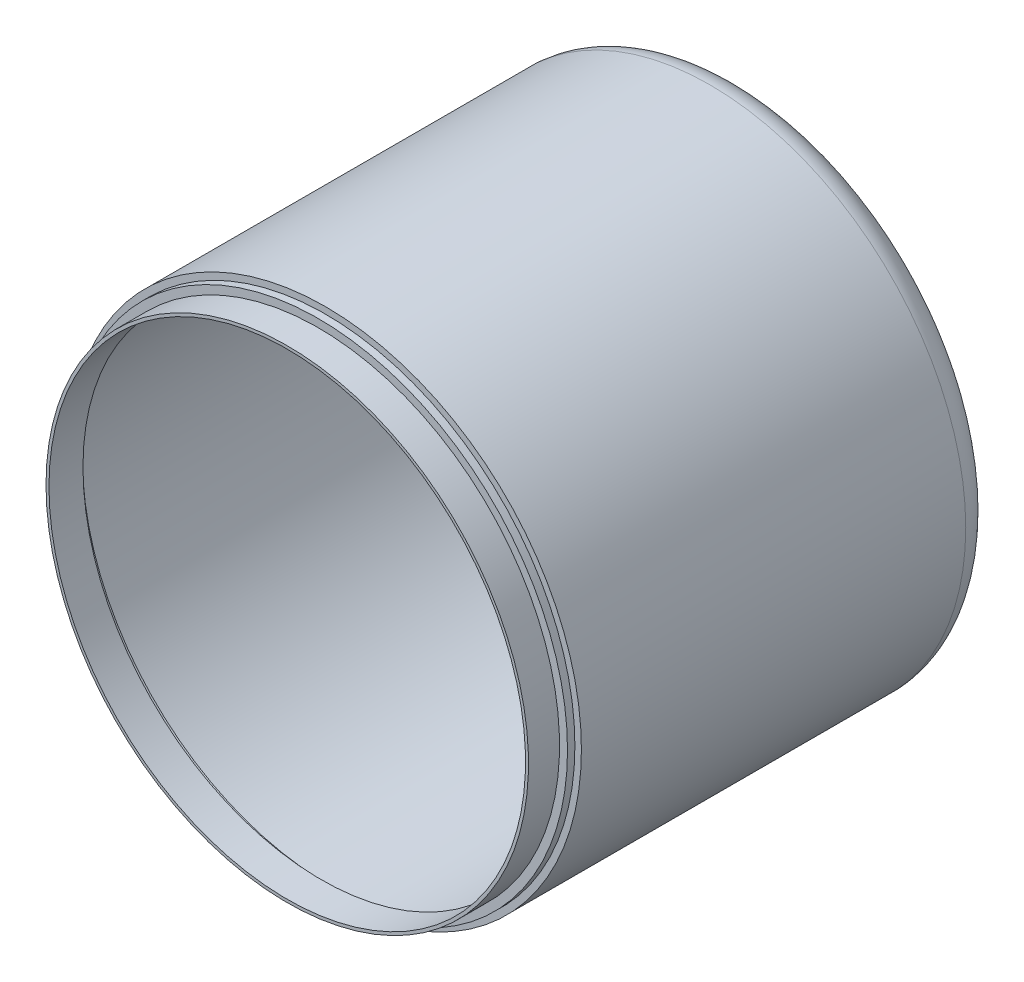
ISO-10303-21;
HEADER;
FILE_DESCRIPTION(('STEP AP214'),'2;1');
FILE_NAME('part.step','',(''),(''),'','','');
FILE_SCHEMA(('AUTOMOTIVE_DESIGN { 1 0 10303 214 1 1 1 1 }'));
ENDSEC;
DATA;
#1=APPLICATION_CONTEXT('core data for automotive mechanical design processes');
#2=APPLICATION_PROTOCOL_DEFINITION('international standard','automotive_design',2000,#1);
#3=PRODUCT_CONTEXT('',#1,'mechanical');
#4=PRODUCT('Part','Part','',(#3));
#5=PRODUCT_RELATED_PRODUCT_CATEGORY('part','',(#4));
#6=PRODUCT_DEFINITION_FORMATION('','',#4);
#7=PRODUCT_DEFINITION_CONTEXT('part definition',#1,'design');
#8=PRODUCT_DEFINITION('design','',#6,#7);
#9=PRODUCT_DEFINITION_SHAPE('','',#8);
#10=(LENGTH_UNIT() NAMED_UNIT(*) SI_UNIT(.MILLI.,.METRE.));
#11=(NAMED_UNIT(*) PLANE_ANGLE_UNIT() SI_UNIT($,.RADIAN.));
#12=(NAMED_UNIT(*) SI_UNIT($,.STERADIAN.) SOLID_ANGLE_UNIT());
#13=UNCERTAINTY_MEASURE_WITH_UNIT(LENGTH_MEASURE(1.E-05),#10,'distance_accuracy_value','');
#14=(GEOMETRIC_REPRESENTATION_CONTEXT(3) GLOBAL_UNCERTAINTY_ASSIGNED_CONTEXT((#13)) GLOBAL_UNIT_ASSIGNED_CONTEXT((#10,
#11,#12)) REPRESENTATION_CONTEXT('',''));
#15=CARTESIAN_POINT('',(0.,0.,0.));
#16=DIRECTION('',(0.,0.,1.));
#17=DIRECTION('',(1.,0.,0.));
#18=AXIS2_PLACEMENT_3D('',#15,#16,#17);
#19=CARTESIAN_POINT('',(0.,0.,2.2));
#20=DIRECTION('',(0.,0.,-1.));
#21=DIRECTION('',(-1.,0.,0.));
#22=AXIS2_PLACEMENT_3D('',#19,#20,#21);
#23=CYLINDRICAL_SURFACE('',#22,70.);
#24=CARTESIAN_POINT('',(0.,0.,2.2));
#25=DIRECTION('',(0.,0.,1.));
#26=DIRECTION('',(1.,0.,0.));
#27=AXIS2_PLACEMENT_3D('',#24,#25,#26);
#28=CIRCLE('',#27,70.);
#29=CARTESIAN_POINT('',(70.,0.,2.2));
#30=VERTEX_POINT('',#29);
#31=EDGE_CURVE('E62',#30,#30,#28,.T.);
#32=ORIENTED_EDGE('',*,*,#31,.F.);
#33=EDGE_LOOP('',(#32));
#34=FACE_BOUND('',#33,.T.);
#35=CARTESIAN_POINT('',(0.,0.,0.));
#36=DIRECTION('',(0.,0.,1.));
#37=DIRECTION('',(1.,0.,0.));
#38=AXIS2_PLACEMENT_3D('',#35,#36,#37);
#39=CIRCLE('',#38,70.);
#40=CARTESIAN_POINT('',(70.,0.,0.));
#41=VERTEX_POINT('',#40);
#42=EDGE_CURVE('E59',#41,#41,#39,.T.);
#43=ORIENTED_EDGE('',*,*,#42,.T.);
#44=EDGE_LOOP('',(#43));
#45=FACE_BOUND('',#44,.T.);
#46=ADVANCED_FACE('F38',(#34,#45),#23,.T.);
#47=CARTESIAN_POINT('',(0.,0.,0.));
#48=DIRECTION('',(0.,0.,1.));
#49=DIRECTION('',(1.,0.,0.));
#50=AXIS2_PLACEMENT_3D('',#47,#48,#49);
#51=PLANE('',#50);
#52=ORIENTED_EDGE('',*,*,#42,.F.);
#53=EDGE_LOOP('',(#52));
#54=FACE_BOUND('',#53,.T.);
#55=ADVANCED_FACE('F123',(#54),#51,.F.);
#56=CARTESIAN_POINT('',(0.,0.,142.2));
#57=DIRECTION('',(0.,0.,-1.));
#58=DIRECTION('',(-1.,0.,0.));
#59=AXIS2_PLACEMENT_3D('',#56,#57,#58);
#60=CYLINDRICAL_SURFACE('',#59,86.5);
#61=CARTESIAN_POINT('',(0.,0.,12.2));
#62=DIRECTION('',(0.,0.,1.));
#63=DIRECTION('',(1.,0.,0.));
#64=AXIS2_PLACEMENT_3D('',#61,#62,#63);
#65=CIRCLE('',#64,86.5);
#66=CARTESIAN_POINT('',(86.5,0.,12.2));
#67=VERTEX_POINT('',#66);
#68=EDGE_CURVE('E45',#67,#67,#65,.T.);
#69=ORIENTED_EDGE('',*,*,#68,.T.);
#70=EDGE_LOOP('',(#69));
#71=FACE_BOUND('',#70,.T.);
#72=CARTESIAN_POINT('',(0.,0.,142.2));
#73=DIRECTION('',(0.,0.,1.));
#74=DIRECTION('',(1.,0.,0.));
#75=AXIS2_PLACEMENT_3D('',#72,#73,#74);
#76=CIRCLE('',#75,86.5);
#77=CARTESIAN_POINT('',(86.5,0.,142.2));
#78=VERTEX_POINT('',#77);
#79=EDGE_CURVE('E63',#78,#78,#76,.T.);
#80=ORIENTED_EDGE('',*,*,#79,.F.);
#81=EDGE_LOOP('',(#80));
#82=FACE_BOUND('',#81,.T.);
#83=ADVANCED_FACE('F129',(#71,#82),#60,.T.);
#84=CARTESIAN_POINT('',(0.,0.,142.2));
#85=DIRECTION('',(0.,0.,1.));
#86=DIRECTION('',(1.,0.,0.));
#87=AXIS2_PLACEMENT_3D('',#84,#85,#86);
#88=PLANE('',#87);
#89=CARTESIAN_POINT('',(0.,0.,142.2));
#90=DIRECTION('',(0.,0.,1.));
#91=DIRECTION('',(1.,0.,0.));
#92=AXIS2_PLACEMENT_3D('',#89,#90,#91);
#93=CIRCLE('',#92,84.3);
#94=CARTESIAN_POINT('',(84.3,0.,142.2));
#95=VERTEX_POINT('',#94);
#96=EDGE_CURVE('E66',#95,#95,#93,.T.);
#97=ORIENTED_EDGE('',*,*,#96,.F.);
#98=EDGE_LOOP('',(#97));
#99=FACE_BOUND('',#98,.T.);
#100=ORIENTED_EDGE('',*,*,#79,.T.);
#101=EDGE_LOOP('',(#100));
#102=FACE_BOUND('',#101,.T.);
#103=ADVANCED_FACE('F187',(#99,#102),#88,.T.);
#104=CARTESIAN_POINT('',(0.,0.,2.2));
#105=DIRECTION('',(0.,0.,1.));
#106=DIRECTION('',(1.,0.,0.));
#107=AXIS2_PLACEMENT_3D('',#104,#105,#106);
#108=PLANE('',#107);
#109=CARTESIAN_POINT('',(0.,0.,2.2));
#110=DIRECTION('',(0.,0.,1.));
#111=DIRECTION('',(1.,0.,0.));
#112=AXIS2_PLACEMENT_3D('',#109,#110,#111);
#113=CIRCLE('',#112,76.5);
#114=CARTESIAN_POINT('',(76.5,0.,2.2));
#115=VERTEX_POINT('',#114);
#116=EDGE_CURVE('E10',#115,#115,#113,.F.);
#117=ORIENTED_EDGE('',*,*,#116,.T.);
#118=EDGE_LOOP('',(#117));
#119=FACE_BOUND('',#118,.T.);
#120=ORIENTED_EDGE('',*,*,#31,.T.);
#121=EDGE_LOOP('',(#120));
#122=FACE_BOUND('',#121,.T.);
#123=ADVANCED_FACE('F185',(#119,#122),#108,.F.);
#124=CARTESIAN_POINT('',(0.,0.,144.7));
#125=DIRECTION('',(0.,0.,-1.));
#126=DIRECTION('',(-1.,0.,0.));
#127=AXIS2_PLACEMENT_3D('',#124,#125,#126);
#128=CYLINDRICAL_SURFACE('',#127,84.3);
#129=CARTESIAN_POINT('',(0.,0.,144.7));
#130=DIRECTION('',(0.,0.,1.));
#131=DIRECTION('',(1.,0.,0.));
#132=AXIS2_PLACEMENT_3D('',#129,#130,#131);
#133=CIRCLE('',#132,84.3);
#134=CARTESIAN_POINT('',(84.3,0.,144.7));
#135=VERTEX_POINT('',#134);
#136=EDGE_CURVE('E69',#135,#135,#133,.T.);
#137=ORIENTED_EDGE('',*,*,#136,.F.);
#138=EDGE_LOOP('',(#137));
#139=FACE_BOUND('',#138,.T.);
#140=ORIENTED_EDGE('',*,*,#96,.T.);
#141=EDGE_LOOP('',(#140));
#142=FACE_BOUND('',#141,.T.);
#143=ADVANCED_FACE('F181',(#139,#142),#128,.T.);
#144=CARTESIAN_POINT('',(0.,0.,144.7));
#145=DIRECTION('',(0.,0.,1.));
#146=DIRECTION('',(1.,0.,0.));
#147=AXIS2_PLACEMENT_3D('',#144,#145,#146);
#148=PLANE('',#147);
#149=CARTESIAN_POINT('',(0.,0.,144.7));
#150=DIRECTION('',(0.,0.,1.));
#151=DIRECTION('',(1.,0.,0.));
#152=AXIS2_PLACEMENT_3D('',#149,#150,#151);
#153=CIRCLE('',#152,81.6);
#154=CARTESIAN_POINT('',(-81.6,0.,144.7));
#155=VERTEX_POINT('',#154);
#156=EDGE_CURVE('E58',#155,#155,#153,.T.);
#157=ORIENTED_EDGE('',*,*,#156,.F.);
#158=EDGE_LOOP('',(#157));
#159=FACE_BOUND('',#158,.T.);
#160=ORIENTED_EDGE('',*,*,#136,.T.);
#161=EDGE_LOOP('',(#160));
#162=FACE_BOUND('',#161,.T.);
#163=ADVANCED_FACE('F172',(#159,#162),#148,.T.);
#164=CARTESIAN_POINT('',(0.,0.,155.2));
#165=DIRECTION('',(0.,0.,-1.));
#166=DIRECTION('',(-1.,0.,0.));
#167=AXIS2_PLACEMENT_3D('',#164,#165,#166);
#168=CYLINDRICAL_SURFACE('',#167,81.6);
#169=CARTESIAN_POINT('',(0.,0.,155.2));
#170=DIRECTION('',(0.,0.,1.));
#171=DIRECTION('',(1.,0.,0.));
#172=AXIS2_PLACEMENT_3D('',#169,#170,#171);
#173=CIRCLE('',#172,81.6);
#174=CARTESIAN_POINT('',(-81.6,0.,155.2));
#175=VERTEX_POINT('',#174);
#176=EDGE_CURVE('E74',#175,#175,#173,.T.);
#177=CARTESIAN_POINT('',(-81.6,0.,155.2));
#178=CARTESIAN_POINT('',(-81.6,0.,155.090625));
#179=CARTESIAN_POINT('',(-81.6,0.,154.98125));
#180=CARTESIAN_POINT('',(-81.6,0.,154.7625));
#181=CARTESIAN_POINT('',(-81.6,0.,154.653125));
#182=CARTESIAN_POINT('',(-81.6,0.,154.434375));
#183=CARTESIAN_POINT('',(-81.6,0.,154.325));
#184=CARTESIAN_POINT('',(-81.6,0.,154.10625));
#185=CARTESIAN_POINT('',(-81.6,0.,153.996875));
#186=CARTESIAN_POINT('',(-81.6,0.,153.778125));
#187=CARTESIAN_POINT('',(-81.6,0.,153.66875));
#188=CARTESIAN_POINT('',(-81.6,0.,153.45));
#189=CARTESIAN_POINT('',(-81.6,0.,153.340625));
#190=CARTESIAN_POINT('',(-81.6,0.,153.121875));
#191=CARTESIAN_POINT('',(-81.6,0.,153.0125));
#192=CARTESIAN_POINT('',(-81.6,0.,152.79375));
#193=CARTESIAN_POINT('',(-81.6,0.,152.684375));
#194=CARTESIAN_POINT('',(-81.6,0.,152.465625));
#195=CARTESIAN_POINT('',(-81.6,0.,152.35625));
#196=CARTESIAN_POINT('',(-81.6,0.,152.1375));
#197=CARTESIAN_POINT('',(-81.6,0.,152.028125));
#198=CARTESIAN_POINT('',(-81.6,0.,151.809375));
#199=CARTESIAN_POINT('',(-81.6,0.,151.7));
#200=CARTESIAN_POINT('',(-81.6,0.,151.48125));
#201=CARTESIAN_POINT('',(-81.6,0.,151.371875));
#202=CARTESIAN_POINT('',(-81.6,0.,151.153125));
#203=CARTESIAN_POINT('',(-81.6,0.,151.04375));
#204=CARTESIAN_POINT('',(-81.6,0.,150.825));
#205=CARTESIAN_POINT('',(-81.6,0.,150.715625));
#206=CARTESIAN_POINT('',(-81.6,0.,150.496875));
#207=CARTESIAN_POINT('',(-81.6,0.,150.3875));
#208=CARTESIAN_POINT('',(-81.6,0.,150.16875));
#209=CARTESIAN_POINT('',(-81.6,0.,150.059375));
#210=CARTESIAN_POINT('',(-81.6,0.,149.840625));
#211=CARTESIAN_POINT('',(-81.6,0.,149.73125));
#212=CARTESIAN_POINT('',(-81.6,0.,149.5125));
#213=CARTESIAN_POINT('',(-81.6,0.,149.403125));
#214=CARTESIAN_POINT('',(-81.6,0.,149.184375));
#215=CARTESIAN_POINT('',(-81.6,0.,149.075));
#216=CARTESIAN_POINT('',(-81.6,0.,148.85625));
#217=CARTESIAN_POINT('',(-81.6,0.,148.746875));
#218=CARTESIAN_POINT('',(-81.6,0.,148.528125));
#219=CARTESIAN_POINT('',(-81.6,0.,148.41875));
#220=CARTESIAN_POINT('',(-81.6,0.,148.2));
#221=CARTESIAN_POINT('',(-81.6,0.,148.090625));
#222=CARTESIAN_POINT('',(-81.6,0.,147.871875));
#223=CARTESIAN_POINT('',(-81.6,0.,147.7625));
#224=CARTESIAN_POINT('',(-81.6,0.,147.54375));
#225=CARTESIAN_POINT('',(-81.6,0.,147.434375));
#226=CARTESIAN_POINT('',(-81.6,0.,147.215625));
#227=CARTESIAN_POINT('',(-81.6,0.,147.10625));
#228=CARTESIAN_POINT('',(-81.6,0.,146.8875));
#229=CARTESIAN_POINT('',(-81.6,0.,146.778125));
#230=CARTESIAN_POINT('',(-81.6,0.,146.559375));
#231=CARTESIAN_POINT('',(-81.6,0.,146.45));
#232=CARTESIAN_POINT('',(-81.6,0.,146.23125));
#233=CARTESIAN_POINT('',(-81.6,0.,146.121875));
#234=CARTESIAN_POINT('',(-81.6,0.,145.903125));
#235=CARTESIAN_POINT('',(-81.6,0.,145.79375));
#236=CARTESIAN_POINT('',(-81.6,0.,145.575));
#237=CARTESIAN_POINT('',(-81.6,0.,145.465625));
#238=CARTESIAN_POINT('',(-81.6,0.,145.246875));
#239=CARTESIAN_POINT('',(-81.6,0.,145.1375));
#240=CARTESIAN_POINT('',(-81.6,0.,144.91875));
#241=CARTESIAN_POINT('',(-81.6,0.,144.809375));
#242=CARTESIAN_POINT('',(-81.6,0.,144.7));
#243=B_SPLINE_CURVE_WITH_KNOTS('',3,(#177,#178,#179,#180,#181,#182,#183,#184,#185,#186,#187,
#188,#189,#190,#191,#192,#193,#194,#195,#196,#197,#198,#199,#200,#201,#202,#203,#204,#205,#206,
#207,#208,#209,#210,#211,#212,#213,#214,#215,#216,#217,#218,#219,#220,#221,#222,#223,#224,#225,
#226,#227,#228,#229,#230,#231,#232,#233,#234,#235,#236,#237,#238,#239,#240,#241,#242),
.UNSPECIFIED.,.F.,.F.,(4,2,2,2,2,2,2,2,2,2,2,2,2,2,2,2,2,2,2,2,2,2,2,2,2,2,2,2,2,2,2,2,4),(0.,
0.328124999999985,0.656249999999997,0.984374999999982,1.31249999999999,1.64062499999998,
1.96874999999999,2.29687499999998,2.62499999999999,2.953125,3.28124999999999,3.609375,
3.93749999999998,4.26562499999999,4.59374999999998,4.92187499999999,5.24999999999998,
5.57812499999999,5.90625,6.23437499999999,6.5625,6.89062499999998,7.21875,7.54687499999998,
7.87499999999999,8.20312499999998,8.53124999999999,8.859375,9.18749999999999,9.515625,
9.84374999999998,10.171875,10.5),.UNSPECIFIED.);
#244=EDGE_CURVE('BSEAM166',#175,#155,#243,.T.);
#245=ORIENTED_EDGE('',*,*,#176,.F.);
#246=ORIENTED_EDGE('',*,*,#156,.T.);
#247=ORIENTED_EDGE('',*,*,#244,.T.);
#248=ORIENTED_EDGE('',*,*,#244,.F.);
#249=EDGE_LOOP('',(#245,#247,#246,#248));
#250=FACE_BOUND('',#249,.T.);
#251=ADVANCED_FACE('F166',(#250),#168,.T.);
#252=CARTESIAN_POINT('',(0.,0.,155.2));
#253=DIRECTION('',(0.,0.,1.));
#254=DIRECTION('',(1.,0.,0.));
#255=AXIS2_PLACEMENT_3D('',#252,#253,#254);
#256=PLANE('',#255);
#257=CARTESIAN_POINT('',(0.,0.,155.2));
#258=DIRECTION('',(0.,0.,1.));
#259=DIRECTION('',(1.,0.,0.));
#260=AXIS2_PLACEMENT_3D('',#257,#258,#259);
#261=CIRCLE('',#260,80.6);
#262=CARTESIAN_POINT('',(-80.6,0.,155.2));
#263=VERTEX_POINT('',#262);
#264=EDGE_CURVE('E80',#263,#263,#261,.T.);
#265=ORIENTED_EDGE('',*,*,#264,.F.);
#266=EDGE_LOOP('',(#265));
#267=FACE_BOUND('',#266,.T.);
#268=ORIENTED_EDGE('',*,*,#176,.T.);
#269=EDGE_LOOP('',(#268));
#270=FACE_BOUND('',#269,.T.);
#271=ADVANCED_FACE('F162',(#267,#270),#256,.T.);
#272=CARTESIAN_POINT('',(0.,0.,2.2));
#273=DIRECTION('',(0.,0.,-1.));
#274=DIRECTION('',(-1.,0.,0.));
#275=AXIS2_PLACEMENT_3D('',#272,#273,#274);
#276=CYLINDRICAL_SURFACE('',#275,69.);
#277=CARTESIAN_POINT('',(0.,0.,3.2));
#278=DIRECTION('',(0.,0.,1.));
#279=DIRECTION('',(1.,0.,0.));
#280=AXIS2_PLACEMENT_3D('',#277,#278,#279);
#281=CIRCLE('',#280,69.);
#282=CARTESIAN_POINT('',(69.,0.,3.2));
#283=VERTEX_POINT('',#282);
#284=EDGE_CURVE('E92',#283,#283,#281,.T.);
#285=ORIENTED_EDGE('',*,*,#284,.T.);
#286=EDGE_LOOP('',(#285));
#287=FACE_BOUND('',#286,.T.);
#288=CARTESIAN_POINT('',(0.,0.,1.));
#289=DIRECTION('',(0.,0.,1.));
#290=DIRECTION('',(1.,0.,0.));
#291=AXIS2_PLACEMENT_3D('',#288,#289,#290);
#292=CIRCLE('',#291,69.);
#293=CARTESIAN_POINT('',(69.,0.,1.));
#294=VERTEX_POINT('',#293);
#295=EDGE_CURVE('E95',#294,#294,#292,.T.);
#296=ORIENTED_EDGE('',*,*,#295,.F.);
#297=EDGE_LOOP('',(#296));
#298=FACE_BOUND('',#297,.T.);
#299=ADVANCED_FACE('F101',(#287,#298),#276,.F.);
#300=CARTESIAN_POINT('',(0.,0.,1.));
#301=DIRECTION('',(0.,0.,1.));
#302=DIRECTION('',(1.,0.,0.));
#303=AXIS2_PLACEMENT_3D('',#300,#301,#302);
#304=PLANE('',#303);
#305=ORIENTED_EDGE('',*,*,#295,.T.);
#306=EDGE_LOOP('',(#305));
#307=FACE_BOUND('',#306,.T.);
#308=ADVANCED_FACE('F150',(#307),#304,.T.);
#309=CARTESIAN_POINT('',(0.,0.,142.2));
#310=DIRECTION('',(0.,0.,-1.));
#311=DIRECTION('',(-1.,0.,0.));
#312=AXIS2_PLACEMENT_3D('',#309,#310,#311);
#313=CYLINDRICAL_SURFACE('',#312,85.5);
#314=CARTESIAN_POINT('',(0.,0.,13.2));
#315=DIRECTION('',(0.,0.,1.));
#316=DIRECTION('',(1.,0.,0.));
#317=AXIS2_PLACEMENT_3D('',#314,#315,#316);
#318=CIRCLE('',#317,85.5);
#319=CARTESIAN_POINT('',(85.5,0.,13.2));
#320=VERTEX_POINT('',#319);
#321=EDGE_CURVE('E49',#320,#320,#318,.F.);
#322=ORIENTED_EDGE('',*,*,#321,.T.);
#323=EDGE_LOOP('',(#322));
#324=FACE_BOUND('',#323,.T.);
#325=CARTESIAN_POINT('',(0.,0.,141.2));
#326=DIRECTION('',(0.,0.,1.));
#327=DIRECTION('',(1.,0.,0.));
#328=AXIS2_PLACEMENT_3D('',#325,#326,#327);
#329=CIRCLE('',#328,85.5);
#330=CARTESIAN_POINT('',(85.5,0.,141.2));
#331=VERTEX_POINT('',#330);
#332=EDGE_CURVE('E89',#331,#331,#329,.T.);
#333=ORIENTED_EDGE('',*,*,#332,.T.);
#334=EDGE_LOOP('',(#333));
#335=FACE_BOUND('',#334,.T.);
#336=ADVANCED_FACE('F119',(#324,#335),#313,.F.);
#337=CARTESIAN_POINT('',(0.,0.,141.2));
#338=DIRECTION('',(0.,0.,1.));
#339=DIRECTION('',(1.,0.,0.));
#340=AXIS2_PLACEMENT_3D('',#337,#338,#339);
#341=PLANE('',#340);
#342=CARTESIAN_POINT('',(0.,0.,141.2));
#343=DIRECTION('',(0.,0.,1.));
#344=DIRECTION('',(1.,0.,0.));
#345=AXIS2_PLACEMENT_3D('',#342,#343,#344);
#346=CIRCLE('',#345,83.3);
#347=CARTESIAN_POINT('',(83.3,0.,141.2));
#348=VERTEX_POINT('',#347);
#349=EDGE_CURVE('E86',#348,#348,#346,.T.);
#350=ORIENTED_EDGE('',*,*,#349,.T.);
#351=EDGE_LOOP('',(#350));
#352=FACE_BOUND('',#351,.T.);
#353=ORIENTED_EDGE('',*,*,#332,.F.);
#354=EDGE_LOOP('',(#353));
#355=FACE_BOUND('',#354,.T.);
#356=ADVANCED_FACE('F107',(#352,#355),#341,.F.);
#357=CARTESIAN_POINT('',(0.,0.,3.2));
#358=DIRECTION('',(0.,0.,1.));
#359=DIRECTION('',(1.,0.,0.));
#360=AXIS2_PLACEMENT_3D('',#357,#358,#359);
#361=PLANE('',#360);
#362=CARTESIAN_POINT('',(0.,0.,3.2));
#363=DIRECTION('',(0.,0.,1.));
#364=DIRECTION('',(1.,0.,0.));
#365=AXIS2_PLACEMENT_3D('',#362,#363,#364);
#366=CIRCLE('',#365,75.5);
#367=CARTESIAN_POINT('',(75.5,0.,3.2));
#368=VERTEX_POINT('',#367);
#369=EDGE_CURVE('E53',#368,#368,#366,.T.);
#370=ORIENTED_EDGE('',*,*,#369,.T.);
#371=EDGE_LOOP('',(#370));
#372=FACE_BOUND('',#371,.T.);
#373=ORIENTED_EDGE('',*,*,#284,.F.);
#374=EDGE_LOOP('',(#373));
#375=FACE_BOUND('',#374,.T.);
#376=ADVANCED_FACE('F104',(#372,#375),#361,.T.);
#377=CARTESIAN_POINT('',(0.,0.,144.7));
#378=DIRECTION('',(0.,0.,-1.));
#379=DIRECTION('',(-1.,0.,0.));
#380=AXIS2_PLACEMENT_3D('',#377,#378,#379);
#381=CYLINDRICAL_SURFACE('',#380,83.3);
#382=CARTESIAN_POINT('',(0.,0.,143.7));
#383=DIRECTION('',(0.,0.,1.));
#384=DIRECTION('',(1.,0.,0.));
#385=AXIS2_PLACEMENT_3D('',#382,#383,#384);
#386=CIRCLE('',#385,83.3);
#387=CARTESIAN_POINT('',(83.3,0.,143.7));
#388=VERTEX_POINT('',#387);
#389=EDGE_CURVE('E83',#388,#388,#386,.T.);
#390=ORIENTED_EDGE('',*,*,#389,.T.);
#391=EDGE_LOOP('',(#390));
#392=FACE_BOUND('',#391,.T.);
#393=ORIENTED_EDGE('',*,*,#349,.F.);
#394=EDGE_LOOP('',(#393));
#395=FACE_BOUND('',#394,.T.);
#396=ADVANCED_FACE('F106',(#392,#395),#381,.F.);
#397=CARTESIAN_POINT('',(0.,0.,143.7));
#398=DIRECTION('',(0.,0.,1.));
#399=DIRECTION('',(1.,0.,0.));
#400=AXIS2_PLACEMENT_3D('',#397,#398,#399);
#401=PLANE('',#400);
#402=CARTESIAN_POINT('',(0.,0.,143.7));
#403=DIRECTION('',(0.,0.,1.));
#404=DIRECTION('',(1.,0.,0.));
#405=AXIS2_PLACEMENT_3D('',#402,#403,#404);
#406=CIRCLE('',#405,80.6);
#407=CARTESIAN_POINT('',(-80.6,0.,143.7));
#408=VERTEX_POINT('',#407);
#409=EDGE_CURVE('E79',#408,#408,#406,.T.);
#410=ORIENTED_EDGE('',*,*,#409,.T.);
#411=EDGE_LOOP('',(#410));
#412=FACE_BOUND('',#411,.T.);
#413=ORIENTED_EDGE('',*,*,#389,.F.);
#414=EDGE_LOOP('',(#413));
#415=FACE_BOUND('',#414,.T.);
#416=ADVANCED_FACE('F115',(#412,#415),#401,.F.);
#417=CARTESIAN_POINT('',(0.,0.,155.2));
#418=DIRECTION('',(0.,0.,-1.));
#419=DIRECTION('',(-1.,0.,0.));
#420=AXIS2_PLACEMENT_3D('',#417,#418,#419);
#421=CYLINDRICAL_SURFACE('',#420,80.6);
#422=CARTESIAN_POINT('',(-80.6,0.,155.2));
#423=CARTESIAN_POINT('',(-80.6,0.,155.080208333333));
#424=CARTESIAN_POINT('',(-80.6,0.,154.960416666667));
#425=CARTESIAN_POINT('',(-80.6,0.,154.720833333333));
#426=CARTESIAN_POINT('',(-80.6,0.,154.601041666667));
#427=CARTESIAN_POINT('',(-80.6,0.,154.361458333333));
#428=CARTESIAN_POINT('',(-80.6,0.,154.241666666667));
#429=CARTESIAN_POINT('',(-80.6,0.,154.002083333333));
#430=CARTESIAN_POINT('',(-80.6,0.,153.882291666667));
#431=CARTESIAN_POINT('',(-80.6,0.,153.642708333333));
#432=CARTESIAN_POINT('',(-80.6,0.,153.522916666667));
#433=CARTESIAN_POINT('',(-80.6,0.,153.283333333333));
#434=CARTESIAN_POINT('',(-80.6,0.,153.163541666667));
#435=CARTESIAN_POINT('',(-80.6,0.,152.923958333333));
#436=CARTESIAN_POINT('',(-80.6,0.,152.804166666667));
#437=CARTESIAN_POINT('',(-80.6,0.,152.564583333333));
#438=CARTESIAN_POINT('',(-80.6,0.,152.444791666667));
#439=CARTESIAN_POINT('',(-80.6,0.,152.205208333333));
#440=CARTESIAN_POINT('',(-80.6,0.,152.085416666667));
#441=CARTESIAN_POINT('',(-80.6,0.,151.845833333333));
#442=CARTESIAN_POINT('',(-80.6,0.,151.726041666667));
#443=CARTESIAN_POINT('',(-80.6,0.,151.486458333333));
#444=CARTESIAN_POINT('',(-80.6,0.,151.366666666667));
#445=CARTESIAN_POINT('',(-80.6,0.,151.127083333333));
#446=CARTESIAN_POINT('',(-80.6,0.,151.007291666667));
#447=CARTESIAN_POINT('',(-80.6,0.,150.767708333333));
#448=CARTESIAN_POINT('',(-80.6,0.,150.647916666667));
#449=CARTESIAN_POINT('',(-80.6,0.,150.408333333333));
#450=CARTESIAN_POINT('',(-80.6,0.,150.288541666667));
#451=CARTESIAN_POINT('',(-80.6,0.,150.048958333333));
#452=CARTESIAN_POINT('',(-80.6,0.,149.929166666667));
#453=CARTESIAN_POINT('',(-80.6,0.,149.689583333333));
#454=CARTESIAN_POINT('',(-80.6,0.,149.569791666667));
#455=CARTESIAN_POINT('',(-80.6,0.,149.330208333333));
#456=CARTESIAN_POINT('',(-80.6,0.,149.210416666667));
#457=CARTESIAN_POINT('',(-80.6,0.,148.970833333333));
#458=CARTESIAN_POINT('',(-80.6,0.,148.851041666667));
#459=CARTESIAN_POINT('',(-80.6,0.,148.611458333333));
#460=CARTESIAN_POINT('',(-80.6,0.,148.491666666667));
#461=CARTESIAN_POINT('',(-80.6,0.,148.252083333333));
#462=CARTESIAN_POINT('',(-80.6,0.,148.132291666667));
#463=CARTESIAN_POINT('',(-80.6,0.,147.892708333333));
#464=CARTESIAN_POINT('',(-80.6,0.,147.772916666667));
#465=CARTESIAN_POINT('',(-80.6,0.,147.533333333333));
#466=CARTESIAN_POINT('',(-80.6,0.,147.413541666667));
#467=CARTESIAN_POINT('',(-80.6,0.,147.173958333333));
#468=CARTESIAN_POINT('',(-80.6,0.,147.054166666667));
#469=CARTESIAN_POINT('',(-80.6,0.,146.814583333333));
#470=CARTESIAN_POINT('',(-80.6,0.,146.694791666667));
#471=CARTESIAN_POINT('',(-80.6,0.,146.455208333333));
#472=CARTESIAN_POINT('',(-80.6,0.,146.335416666667));
#473=CARTESIAN_POINT('',(-80.6,0.,146.095833333333));
#474=CARTESIAN_POINT('',(-80.6,0.,145.976041666667));
#475=CARTESIAN_POINT('',(-80.6,0.,145.736458333333));
#476=CARTESIAN_POINT('',(-80.6,0.,145.616666666667));
#477=CARTESIAN_POINT('',(-80.6,0.,145.377083333333));
#478=CARTESIAN_POINT('',(-80.6,0.,145.257291666667));
#479=CARTESIAN_POINT('',(-80.6,0.,145.017708333333));
#480=CARTESIAN_POINT('',(-80.6,0.,144.897916666667));
#481=CARTESIAN_POINT('',(-80.6,0.,144.658333333333));
#482=CARTESIAN_POINT('',(-80.6,0.,144.538541666667));
#483=CARTESIAN_POINT('',(-80.6,0.,144.298958333333));
#484=CARTESIAN_POINT('',(-80.6,0.,144.179166666667));
#485=CARTESIAN_POINT('',(-80.6,0.,143.939583333333));
#486=CARTESIAN_POINT('',(-80.6,0.,143.819791666667));
#487=CARTESIAN_POINT('',(-80.6,0.,143.7));
#488=B_SPLINE_CURVE_WITH_KNOTS('',3,(#422,#423,#424,#425,#426,#427,#428,#429,#430,#431,#432,
#433,#434,#435,#436,#437,#438,#439,#440,#441,#442,#443,#444,#445,#446,#447,#448,#449,#450,#451,
#452,#453,#454,#455,#456,#457,#458,#459,#460,#461,#462,#463,#464,#465,#466,#467,#468,#469,#470,
#471,#472,#473,#474,#475,#476,#477,#478,#479,#480,#481,#482,#483,#484,#485,#486,#487),
.UNSPECIFIED.,.F.,.F.,(4,2,2,2,2,2,2,2,2,2,2,2,2,2,2,2,2,2,2,2,2,2,2,2,2,2,2,2,2,2,2,2,4),(0.,
0.359374999999995,0.71874999999999,1.07812499999999,1.43749999999998,1.79687499999998,2.15625,
2.51562499999999,2.87499999999999,3.23437499999998,3.59374999999998,3.953125,4.3125,
4.67187499999999,5.03124999999999,5.39062499999998,5.74999999999998,6.109375,6.46875,
6.82812499999999,7.18749999999999,7.54687499999998,7.90625,8.265625,8.62499999999999,
8.98437499999999,9.34374999999998,9.70312499999998,10.0625,10.421875,10.78125,11.140625,11.5),.UNSPECIFIED.);
#489=EDGE_CURVE('BSEAM137',#263,#408,#488,.T.);
#490=ORIENTED_EDGE('',*,*,#264,.T.);
#491=ORIENTED_EDGE('',*,*,#409,.F.);
#492=ORIENTED_EDGE('',*,*,#489,.T.);
#493=ORIENTED_EDGE('',*,*,#489,.F.);
#494=EDGE_LOOP('',(#490,#492,#491,#493));
#495=FACE_BOUND('',#494,.T.);
#496=ADVANCED_FACE('F137',(#495),#421,.F.);
#497=CARTESIAN_POINT('',(0.,0.,13.2));
#498=DIRECTION('',(0.,0.,1.));
#499=DIRECTION('',(1.,0.,0.));
#500=AXIS2_PLACEMENT_3D('',#497,#498,#499);
#501=TOROIDAL_SURFACE('',#500,75.5,10.);
#502=ORIENTED_EDGE('',*,*,#321,.F.);
#503=EDGE_LOOP('',(#502));
#504=FACE_BOUND('',#503,.T.);
#505=ORIENTED_EDGE('',*,*,#369,.F.);
#506=EDGE_LOOP('',(#505));
#507=FACE_BOUND('',#506,.T.);
#508=ADVANCED_FACE('F135',(#504,#507),#501,.F.);
#509=CARTESIAN_POINT('',(0.,0.,12.2));
#510=DIRECTION('',(0.,0.,1.));
#511=DIRECTION('',(1.,0.,0.));
#512=AXIS2_PLACEMENT_3D('',#509,#510,#511);
#513=TOROIDAL_SURFACE('',#512,76.5,10.);
#514=ORIENTED_EDGE('',*,*,#116,.F.);
#515=EDGE_LOOP('',(#514));
#516=FACE_BOUND('',#515,.T.);
#517=ORIENTED_EDGE('',*,*,#68,.F.);
#518=EDGE_LOOP('',(#517));
#519=FACE_BOUND('',#518,.T.);
#520=ADVANCED_FACE('F40',(#516,#519),#513,.T.);
#521=CLOSED_SHELL('',(#46,#55,#83,#103,#123,#143,#163,#251,#271,#299,#308,#336,#356,#376,#396,
#416,#496,#508,#520));
#522=MANIFOLD_SOLID_BREP('B2',#521);
#523=ADVANCED_BREP_SHAPE_REPRESENTATION('',(#18,#522),#14);
#524=SHAPE_DEFINITION_REPRESENTATION(#9,#523);
ENDSEC;
END-ISO-10303-21;
